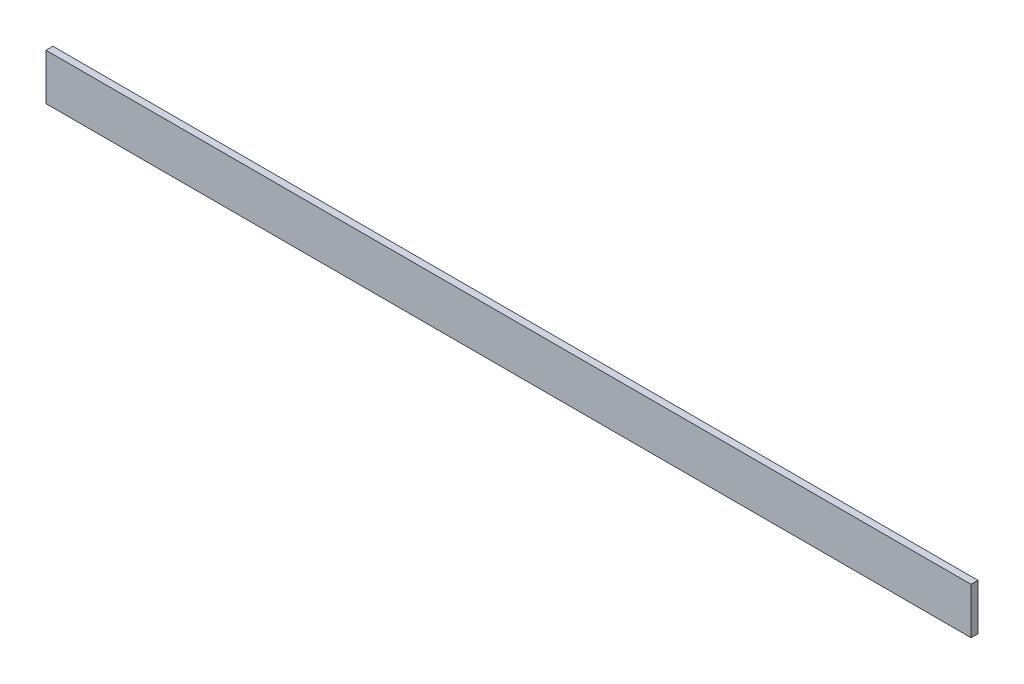
ISO-10303-21;
HEADER;
FILE_DESCRIPTION(('STEP AP214'),'2;1');
FILE_NAME('part.step','',(''),(''),'','','');
FILE_SCHEMA(('AUTOMOTIVE_DESIGN { 1 0 10303 214 1 1 1 1 }'));
ENDSEC;
DATA;
#1=APPLICATION_CONTEXT('core data for automotive mechanical design processes');
#2=APPLICATION_PROTOCOL_DEFINITION('international standard','automotive_design',2000,#1);
#3=PRODUCT_CONTEXT('',#1,'mechanical');
#4=PRODUCT('Part','Part','',(#3));
#5=PRODUCT_RELATED_PRODUCT_CATEGORY('part','',(#4));
#6=PRODUCT_DEFINITION_FORMATION('','',#4);
#7=PRODUCT_DEFINITION_CONTEXT('part definition',#1,'design');
#8=PRODUCT_DEFINITION('design','',#6,#7);
#9=PRODUCT_DEFINITION_SHAPE('','',#8);
#10=(LENGTH_UNIT() NAMED_UNIT(*) SI_UNIT(.MILLI.,.METRE.));
#11=(NAMED_UNIT(*) PLANE_ANGLE_UNIT() SI_UNIT($,.RADIAN.));
#12=(NAMED_UNIT(*) SI_UNIT($,.STERADIAN.) SOLID_ANGLE_UNIT());
#13=UNCERTAINTY_MEASURE_WITH_UNIT(LENGTH_MEASURE(1.E-05),#10,'distance_accuracy_value','');
#14=(GEOMETRIC_REPRESENTATION_CONTEXT(3) GLOBAL_UNCERTAINTY_ASSIGNED_CONTEXT((#13)) GLOBAL_UNIT_ASSIGNED_CONTEXT((#10,
#11,#12)) REPRESENTATION_CONTEXT('',''));
#15=CARTESIAN_POINT('',(0.,0.,0.));
#16=DIRECTION('',(0.,0.,1.));
#17=DIRECTION('',(1.,0.,0.));
#18=AXIS2_PLACEMENT_3D('',#15,#16,#17);
#19=CARTESIAN_POINT('',(0.,0.,3.));
#20=DIRECTION('',(1.,0.,0.));
#21=DIRECTION('',(0.,0.,-1.));
#22=AXIS2_PLACEMENT_3D('',#19,#20,#21);
#23=PLANE('',#22);
#24=DIRECTION('',(0.,-1.,0.));
#25=VECTOR('',#24,1.);
#26=CARTESIAN_POINT('',(0.,0.,0.));
#27=LINE('',#26,#25);
#28=CARTESIAN_POINT('',(0.,20.,0.));
#29=VERTEX_POINT('',#28);
#30=CARTESIAN_POINT('',(0.,0.,0.));
#31=VERTEX_POINT('',#30);
#32=EDGE_CURVE('E95',#29,#31,#27,.T.);
#33=ORIENTED_EDGE('',*,*,#32,.T.);
#34=DIRECTION('',(0.,0.,-1.));
#35=VECTOR('',#34,1.);
#36=CARTESIAN_POINT('',(0.,0.,3.));
#37=LINE('',#36,#35);
#38=CARTESIAN_POINT('',(0.,0.,3.));
#39=VERTEX_POINT('',#38);
#40=EDGE_CURVE('E11',#39,#31,#37,.T.);
#41=ORIENTED_EDGE('',*,*,#40,.F.);
#42=DIRECTION('',(0.,-1.,0.));
#43=VECTOR('',#42,1.);
#44=CARTESIAN_POINT('',(0.,0.,3.));
#45=LINE('',#44,#43);
#46=CARTESIAN_POINT('',(0.,20.,3.));
#47=VERTEX_POINT('',#46);
#48=EDGE_CURVE('E83',#47,#39,#45,.T.);
#49=ORIENTED_EDGE('',*,*,#48,.F.);
#50=DIRECTION('',(0.,0.,-1.));
#51=VECTOR('',#50,1.);
#52=CARTESIAN_POINT('',(0.,20.,3.));
#53=LINE('',#52,#51);
#54=EDGE_CURVE('E91',#47,#29,#53,.T.);
#55=ORIENTED_EDGE('',*,*,#54,.T.);
#56=EDGE_LOOP('',(#33,#41,#49,#55));
#57=FACE_BOUND('',#56,.T.);
#58=ADVANCED_FACE('F32',(#57),#23,.F.);
#59=CARTESIAN_POINT('',(0.,0.,3.));
#60=DIRECTION('',(0.,1.,0.));
#61=DIRECTION('',(0.,0.,1.));
#62=AXIS2_PLACEMENT_3D('',#59,#60,#61);
#63=PLANE('',#62);
#64=DIRECTION('',(1.,0.,0.));
#65=VECTOR('',#64,1.);
#66=CARTESIAN_POINT('',(0.,0.,0.));
#67=LINE('',#66,#65);
#68=CARTESIAN_POINT('',(400.,0.,0.));
#69=VERTEX_POINT('',#68);
#70=EDGE_CURVE('E87',#31,#69,#67,.T.);
#71=ORIENTED_EDGE('',*,*,#70,.T.);
#72=DIRECTION('',(0.,0.,-1.));
#73=VECTOR('',#72,1.);
#74=CARTESIAN_POINT('',(400.,0.,3.));
#75=LINE('',#74,#73);
#76=CARTESIAN_POINT('',(400.,0.,3.));
#77=VERTEX_POINT('',#76);
#78=EDGE_CURVE('E40',#77,#69,#75,.T.);
#79=ORIENTED_EDGE('',*,*,#78,.F.);
#80=DIRECTION('',(1.,0.,0.));
#81=VECTOR('',#80,1.);
#82=CARTESIAN_POINT('',(0.,0.,3.));
#83=LINE('',#82,#81);
#84=EDGE_CURVE('E78',#39,#77,#83,.T.);
#85=ORIENTED_EDGE('',*,*,#84,.F.);
#86=ORIENTED_EDGE('',*,*,#40,.T.);
#87=EDGE_LOOP('',(#71,#79,#85,#86));
#88=FACE_BOUND('',#87,.T.);
#89=ADVANCED_FACE('F86',(#88),#63,.F.);
#90=CARTESIAN_POINT('',(400.,0.,3.));
#91=DIRECTION('',(-1.,0.,0.));
#92=DIRECTION('',(0.,0.,1.));
#93=AXIS2_PLACEMENT_3D('',#90,#91,#92);
#94=PLANE('',#93);
#95=DIRECTION('',(0.,1.,0.));
#96=VECTOR('',#95,1.);
#97=CARTESIAN_POINT('',(400.,0.,0.));
#98=LINE('',#97,#96);
#99=CARTESIAN_POINT('',(400.,20.,0.));
#100=VERTEX_POINT('',#99);
#101=EDGE_CURVE('E65',#69,#100,#98,.T.);
#102=ORIENTED_EDGE('',*,*,#101,.T.);
#103=DIRECTION('',(0.,0.,-1.));
#104=VECTOR('',#103,1.);
#105=CARTESIAN_POINT('',(400.,20.,3.));
#106=LINE('',#105,#104);
#107=CARTESIAN_POINT('',(400.,20.,3.));
#108=VERTEX_POINT('',#107);
#109=EDGE_CURVE('E88',#108,#100,#106,.T.);
#110=ORIENTED_EDGE('',*,*,#109,.F.);
#111=DIRECTION('',(0.,1.,0.));
#112=VECTOR('',#111,1.);
#113=CARTESIAN_POINT('',(400.,0.,3.));
#114=LINE('',#113,#112);
#115=EDGE_CURVE('E81',#77,#108,#114,.T.);
#116=ORIENTED_EDGE('',*,*,#115,.F.);
#117=ORIENTED_EDGE('',*,*,#78,.T.);
#118=EDGE_LOOP('',(#102,#110,#116,#117));
#119=FACE_BOUND('',#118,.T.);
#120=ADVANCED_FACE('F89',(#119),#94,.F.);
#121=CARTESIAN_POINT('',(0.,20.,3.));
#122=DIRECTION('',(0.,-1.,0.));
#123=DIRECTION('',(0.,0.,-1.));
#124=AXIS2_PLACEMENT_3D('',#121,#122,#123);
#125=PLANE('',#124);
#126=DIRECTION('',(-1.,0.,0.));
#127=VECTOR('',#126,1.);
#128=CARTESIAN_POINT('',(0.,20.,0.));
#129=LINE('',#128,#127);
#130=EDGE_CURVE('E71',#100,#29,#129,.T.);
#131=ORIENTED_EDGE('',*,*,#130,.T.);
#132=ORIENTED_EDGE('',*,*,#54,.F.);
#133=DIRECTION('',(-1.,0.,0.));
#134=VECTOR('',#133,1.);
#135=CARTESIAN_POINT('',(0.,20.,3.));
#136=LINE('',#135,#134);
#137=EDGE_CURVE('E48',#108,#47,#136,.T.);
#138=ORIENTED_EDGE('',*,*,#137,.F.);
#139=ORIENTED_EDGE('',*,*,#109,.T.);
#140=EDGE_LOOP('',(#131,#132,#138,#139));
#141=FACE_BOUND('',#140,.T.);
#142=ADVANCED_FACE('F102',(#141),#125,.F.);
#143=CARTESIAN_POINT('',(0.,0.,3.));
#144=DIRECTION('',(0.,0.,-1.));
#145=DIRECTION('',(-1.,0.,0.));
#146=AXIS2_PLACEMENT_3D('',#143,#144,#145);
#147=PLANE('',#146);
#148=ORIENTED_EDGE('',*,*,#48,.T.);
#149=ORIENTED_EDGE('',*,*,#84,.T.);
#150=ORIENTED_EDGE('',*,*,#115,.T.);
#151=ORIENTED_EDGE('',*,*,#137,.T.);
#152=EDGE_LOOP('',(#148,#149,#150,#151));
#153=FACE_BOUND('',#152,.T.);
#154=ADVANCED_FACE('F79',(#153),#147,.F.);
#155=CARTESIAN_POINT('',(0.,0.,0.));
#156=DIRECTION('',(0.,0.,-1.));
#157=DIRECTION('',(-1.,0.,0.));
#158=AXIS2_PLACEMENT_3D('',#155,#156,#157);
#159=PLANE('',#158);
#160=ORIENTED_EDGE('',*,*,#32,.F.);
#161=ORIENTED_EDGE('',*,*,#130,.F.);
#162=ORIENTED_EDGE('',*,*,#101,.F.);
#163=ORIENTED_EDGE('',*,*,#70,.F.);
#164=EDGE_LOOP('',(#160,#161,#162,#163));
#165=FACE_BOUND('',#164,.T.);
#166=ADVANCED_FACE('F105',(#165),#159,.T.);
#167=CLOSED_SHELL('',(#58,#89,#120,#142,#154,#166));
#168=MANIFOLD_SOLID_BREP('B2',#167);
#169=ADVANCED_BREP_SHAPE_REPRESENTATION('',(#18,#168),#14);
#170=SHAPE_DEFINITION_REPRESENTATION(#9,#169);
ENDSEC;
END-ISO-10303-21;
